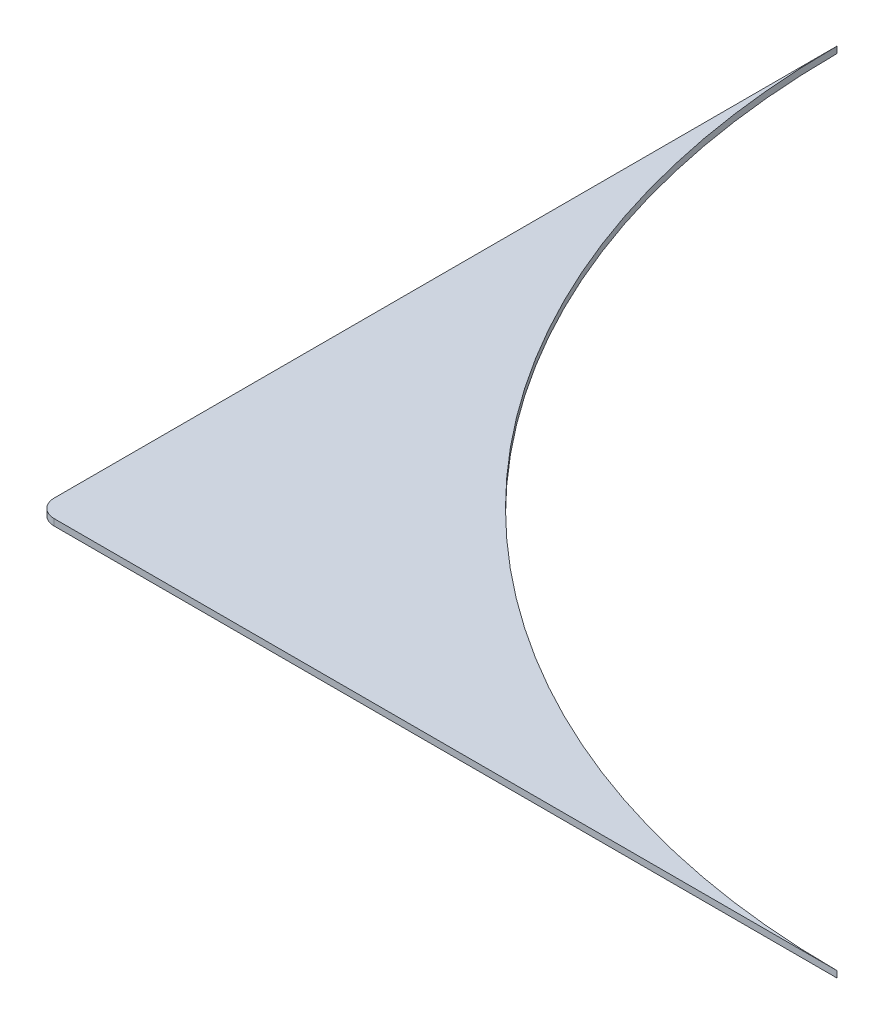
ISO-10303-21;
HEADER;
FILE_DESCRIPTION(('STEP AP214'),'2;1');
FILE_NAME('part.step','',(''),(''),'','','');
FILE_SCHEMA(('AUTOMOTIVE_DESIGN { 1 0 10303 214 1 1 1 1 }'));
ENDSEC;
DATA;
#1=APPLICATION_CONTEXT('core data for automotive mechanical design processes');
#2=APPLICATION_PROTOCOL_DEFINITION('international standard','automotive_design',2000,#1);
#3=PRODUCT_CONTEXT('',#1,'mechanical');
#4=PRODUCT('Part','Part','',(#3));
#5=PRODUCT_RELATED_PRODUCT_CATEGORY('part','',(#4));
#6=PRODUCT_DEFINITION_FORMATION('','',#4);
#7=PRODUCT_DEFINITION_CONTEXT('part definition',#1,'design');
#8=PRODUCT_DEFINITION('design','',#6,#7);
#9=PRODUCT_DEFINITION_SHAPE('','',#8);
#10=(LENGTH_UNIT() NAMED_UNIT(*) SI_UNIT(.MILLI.,.METRE.));
#11=(NAMED_UNIT(*) PLANE_ANGLE_UNIT() SI_UNIT($,.RADIAN.));
#12=(NAMED_UNIT(*) SI_UNIT($,.STERADIAN.) SOLID_ANGLE_UNIT());
#13=UNCERTAINTY_MEASURE_WITH_UNIT(LENGTH_MEASURE(1.E-05),#10,'distance_accuracy_value','');
#14=(GEOMETRIC_REPRESENTATION_CONTEXT(3) GLOBAL_UNCERTAINTY_ASSIGNED_CONTEXT((#13)) GLOBAL_UNIT_ASSIGNED_CONTEXT((#10,
#11,#12)) REPRESENTATION_CONTEXT('',''));
#15=CARTESIAN_POINT('',(0.,0.,0.));
#16=DIRECTION('',(0.,0.,1.));
#17=DIRECTION('',(1.,0.,0.));
#18=AXIS2_PLACEMENT_3D('',#15,#16,#17);
#19=CARTESIAN_POINT('',(-148.209,1.524,184.209));
#20=DIRECTION('',(0.,-1.,0.));
#21=DIRECTION('',(0.,0.,-1.));
#22=AXIS2_PLACEMENT_3D('',#19,#20,#21);
#23=CYLINDRICAL_SURFACE('',#22,4.191);
#24=CARTESIAN_POINT('',(-148.209,0.,184.209));
#25=DIRECTION('',(0.,1.,0.));
#26=DIRECTION('',(0.,0.,1.));
#27=AXIS2_PLACEMENT_3D('',#24,#25,#26);
#28=CIRCLE('',#27,4.191);
#29=CARTESIAN_POINT('',(-152.4,0.,184.209));
#30=VERTEX_POINT('',#29);
#31=CARTESIAN_POINT('',(-148.209,0.,188.4));
#32=VERTEX_POINT('',#31);
#33=EDGE_CURVE('E96',#30,#32,#28,.T.);
#34=ORIENTED_EDGE('',*,*,#33,.T.);
#35=DIRECTION('',(0.,-1.,0.));
#36=VECTOR('',#35,1.);
#37=CARTESIAN_POINT('',(-148.209,1.524,188.4));
#38=LINE('',#37,#36);
#39=CARTESIAN_POINT('',(-148.209,1.524,188.4));
#40=VERTEX_POINT('',#39);
#41=EDGE_CURVE('E11',#40,#32,#38,.T.);
#42=ORIENTED_EDGE('',*,*,#41,.F.);
#43=CARTESIAN_POINT('',(-148.209,1.524,184.209));
#44=DIRECTION('',(0.,1.,0.));
#45=DIRECTION('',(0.,0.,1.));
#46=AXIS2_PLACEMENT_3D('',#43,#44,#45);
#47=CIRCLE('',#46,4.191);
#48=CARTESIAN_POINT('',(-152.4,1.524,184.209));
#49=VERTEX_POINT('',#48);
#50=EDGE_CURVE('E84',#49,#40,#47,.T.);
#51=ORIENTED_EDGE('',*,*,#50,.F.);
#52=DIRECTION('',(0.,-1.,0.));
#53=VECTOR('',#52,1.);
#54=CARTESIAN_POINT('',(-152.4,1.524,184.209));
#55=LINE('',#54,#53);
#56=EDGE_CURVE('E92',#49,#30,#55,.T.);
#57=ORIENTED_EDGE('',*,*,#56,.T.);
#58=EDGE_LOOP('',(#34,#42,#51,#57));
#59=FACE_BOUND('',#58,.T.);
#60=ADVANCED_FACE('F33',(#59),#23,.T.);
#61=CARTESIAN_POINT('',(-148.209,1.524,188.4));
#62=DIRECTION('',(0.,0.,-1.));
#63=DIRECTION('',(-1.,0.,0.));
#64=AXIS2_PLACEMENT_3D('',#61,#62,#63);
#65=PLANE('',#64);
#66=DIRECTION('',(1.,0.,0.));
#67=VECTOR('',#66,1.);
#68=CARTESIAN_POINT('',(-148.209,0.,188.4));
#69=LINE('',#68,#67);
#70=CARTESIAN_POINT('',(35.941,0.,188.4));
#71=VERTEX_POINT('',#70);
#72=EDGE_CURVE('E88',#32,#71,#69,.T.);
#73=ORIENTED_EDGE('',*,*,#72,.T.);
#74=DIRECTION('',(0.,-1.,0.));
#75=VECTOR('',#74,1.);
#76=CARTESIAN_POINT('',(35.941,1.524,188.4));
#77=LINE('',#76,#75);
#78=CARTESIAN_POINT('',(35.941,1.524,188.4));
#79=VERTEX_POINT('',#78);
#80=EDGE_CURVE('E41',#79,#71,#77,.T.);
#81=ORIENTED_EDGE('',*,*,#80,.F.);
#82=DIRECTION('',(1.,0.,0.));
#83=VECTOR('',#82,1.);
#84=CARTESIAN_POINT('',(-148.209,1.524,188.4));
#85=LINE('',#84,#83);
#86=EDGE_CURVE('E79',#40,#79,#85,.T.);
#87=ORIENTED_EDGE('',*,*,#86,.F.);
#88=ORIENTED_EDGE('',*,*,#41,.T.);
#89=EDGE_LOOP('',(#73,#81,#87,#88));
#90=FACE_BOUND('',#89,.T.);
#91=ADVANCED_FACE('F87',(#90),#65,.F.);
#92=CARTESIAN_POINT('',(36.0000092412168,1.524,0.));
#93=DIRECTION('',(0.,-1.,0.));
#94=DIRECTION('',(0.,0.,-1.));
#95=AXIS2_PLACEMENT_3D('',#92,#93,#94);
#96=CYLINDRICAL_SURFACE('',#95,188.400009241217);
#97=CARTESIAN_POINT('',(36.0000092412168,0.,0.));
#98=DIRECTION('',(0.,-1.,0.));
#99=DIRECTION('',(0.,0.,1.));
#100=AXIS2_PLACEMENT_3D('',#97,#98,#99);
#101=CIRCLE('',#100,188.400009241217);
#102=CARTESIAN_POINT('',(-152.4,0.,0.));
#103=VERTEX_POINT('',#102);
#104=EDGE_CURVE('E66',#71,#103,#101,.T.);
#105=ORIENTED_EDGE('',*,*,#104,.T.);
#106=DIRECTION('',(0.,-1.,0.));
#107=VECTOR('',#106,1.);
#108=CARTESIAN_POINT('',(-152.4,1.524,0.));
#109=LINE('',#108,#107);
#110=CARTESIAN_POINT('',(-152.4,1.524,0.));
#111=VERTEX_POINT('',#110);
#112=EDGE_CURVE('E89',#111,#103,#109,.T.);
#113=ORIENTED_EDGE('',*,*,#112,.F.);
#114=CARTESIAN_POINT('',(36.0000092412168,1.524,0.));
#115=DIRECTION('',(0.,-1.,0.));
#116=DIRECTION('',(0.,0.,1.));
#117=AXIS2_PLACEMENT_3D('',#114,#115,#116);
#118=CIRCLE('',#117,188.400009241217);
#119=EDGE_CURVE('E82',#79,#111,#118,.T.);
#120=ORIENTED_EDGE('',*,*,#119,.F.);
#121=ORIENTED_EDGE('',*,*,#80,.T.);
#122=EDGE_LOOP('',(#105,#113,#120,#121));
#123=FACE_BOUND('',#122,.T.);
#124=ADVANCED_FACE('F90',(#123),#96,.F.);
#125=CARTESIAN_POINT('',(-152.4,1.524,0.));
#126=DIRECTION('',(1.,0.,0.));
#127=DIRECTION('',(0.,0.,-1.));
#128=AXIS2_PLACEMENT_3D('',#125,#126,#127);
#129=PLANE('',#128);
#130=DIRECTION('',(0.,0.,1.));
#131=VECTOR('',#130,1.);
#132=CARTESIAN_POINT('',(-152.4,0.,0.));
#133=LINE('',#132,#131);
#134=EDGE_CURVE('E72',#103,#30,#133,.T.);
#135=ORIENTED_EDGE('',*,*,#134,.T.);
#136=ORIENTED_EDGE('',*,*,#56,.F.);
#137=DIRECTION('',(0.,0.,1.));
#138=VECTOR('',#137,1.);
#139=CARTESIAN_POINT('',(-152.4,1.524,0.));
#140=LINE('',#139,#138);
#141=EDGE_CURVE('E49',#111,#49,#140,.T.);
#142=ORIENTED_EDGE('',*,*,#141,.F.);
#143=ORIENTED_EDGE('',*,*,#112,.T.);
#144=EDGE_LOOP('',(#135,#136,#142,#143));
#145=FACE_BOUND('',#144,.T.);
#146=ADVANCED_FACE('F103',(#145),#129,.F.);
#147=CARTESIAN_POINT('',(-148.209,1.524,184.209));
#148=DIRECTION('',(0.,1.,0.));
#149=DIRECTION('',(0.,0.,1.));
#150=AXIS2_PLACEMENT_3D('',#147,#148,#149);
#151=PLANE('',#150);
#152=ORIENTED_EDGE('',*,*,#50,.T.);
#153=ORIENTED_EDGE('',*,*,#86,.T.);
#154=ORIENTED_EDGE('',*,*,#119,.T.);
#155=ORIENTED_EDGE('',*,*,#141,.T.);
#156=EDGE_LOOP('',(#152,#153,#154,#155));
#157=FACE_BOUND('',#156,.T.);
#158=ADVANCED_FACE('F80',(#157),#151,.T.);
#159=CARTESIAN_POINT('',(-148.209,0.,184.209));
#160=DIRECTION('',(0.,1.,0.));
#161=DIRECTION('',(0.,0.,1.));
#162=AXIS2_PLACEMENT_3D('',#159,#160,#161);
#163=PLANE('',#162);
#164=ORIENTED_EDGE('',*,*,#33,.F.);
#165=ORIENTED_EDGE('',*,*,#134,.F.);
#166=ORIENTED_EDGE('',*,*,#104,.F.);
#167=ORIENTED_EDGE('',*,*,#72,.F.);
#168=EDGE_LOOP('',(#164,#165,#166,#167));
#169=FACE_BOUND('',#168,.T.);
#170=ADVANCED_FACE('F106',(#169),#163,.F.);
#171=CLOSED_SHELL('',(#60,#91,#124,#146,#158,#170));
#172=MANIFOLD_SOLID_BREP('B2',#171);
#173=ADVANCED_BREP_SHAPE_REPRESENTATION('',(#18,#172),#14);
#174=SHAPE_DEFINITION_REPRESENTATION(#9,#173);
ENDSEC;
END-ISO-10303-21;
